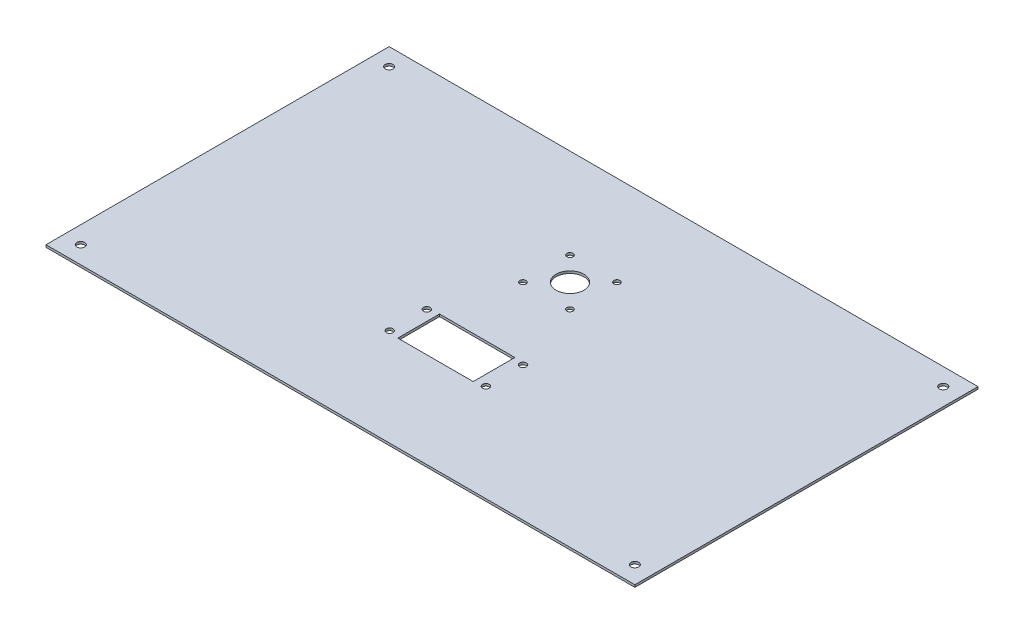
ISO-10303-21;
HEADER;
FILE_DESCRIPTION(('STEP AP214'),'2;1');
FILE_NAME('part.step','',(''),(''),'','','');
FILE_SCHEMA(('AUTOMOTIVE_DESIGN { 1 0 10303 214 1 1 1 1 }'));
ENDSEC;
DATA;
#1=APPLICATION_CONTEXT('core data for automotive mechanical design processes');
#2=APPLICATION_PROTOCOL_DEFINITION('international standard','automotive_design',2000,#1);
#3=PRODUCT_CONTEXT('',#1,'mechanical');
#4=PRODUCT('Part','Part','',(#3));
#5=PRODUCT_RELATED_PRODUCT_CATEGORY('part','',(#4));
#6=PRODUCT_DEFINITION_FORMATION('','',#4);
#7=PRODUCT_DEFINITION_CONTEXT('part definition',#1,'design');
#8=PRODUCT_DEFINITION('design','',#6,#7);
#9=PRODUCT_DEFINITION_SHAPE('','',#8);
#10=(LENGTH_UNIT() NAMED_UNIT(*) SI_UNIT(.MILLI.,.METRE.));
#11=(NAMED_UNIT(*) PLANE_ANGLE_UNIT() SI_UNIT($,.RADIAN.));
#12=(NAMED_UNIT(*) SI_UNIT($,.STERADIAN.) SOLID_ANGLE_UNIT());
#13=UNCERTAINTY_MEASURE_WITH_UNIT(LENGTH_MEASURE(1.E-05),#10,'distance_accuracy_value','');
#14=(GEOMETRIC_REPRESENTATION_CONTEXT(3) GLOBAL_UNCERTAINTY_ASSIGNED_CONTEXT((#13)) GLOBAL_UNIT_ASSIGNED_CONTEXT((#10,
#11,#12)) REPRESENTATION_CONTEXT('',''));
#15=CARTESIAN_POINT('',(0.,0.,0.));
#16=DIRECTION('',(0.,0.,1.));
#17=DIRECTION('',(1.,0.,0.));
#18=AXIS2_PLACEMENT_3D('',#15,#16,#17);
#19=CARTESIAN_POINT('',(254.,2.,148.));
#20=DIRECTION('',(-1.,0.,0.));
#21=DIRECTION('',(0.,0.,1.));
#22=AXIS2_PLACEMENT_3D('',#19,#20,#21);
#23=PLANE('',#22);
#24=DIRECTION('',(0.,0.,-1.));
#25=VECTOR('',#24,1.);
#26=CARTESIAN_POINT('',(254.,0.,148.));
#27=LINE('',#26,#25);
#28=CARTESIAN_POINT('',(254.,0.,148.));
#29=VERTEX_POINT('',#28);
#30=CARTESIAN_POINT('',(254.,0.,-148.));
#31=VERTEX_POINT('',#30);
#32=EDGE_CURVE('E154',#29,#31,#27,.T.);
#33=ORIENTED_EDGE('',*,*,#32,.T.);
#34=DIRECTION('',(0.,-1.,0.));
#35=VECTOR('',#34,1.);
#36=CARTESIAN_POINT('',(254.,2.,-148.));
#37=LINE('',#36,#35);
#38=CARTESIAN_POINT('',(254.,2.,-148.));
#39=VERTEX_POINT('',#38);
#40=EDGE_CURVE('E170',#39,#31,#37,.T.);
#41=ORIENTED_EDGE('',*,*,#40,.F.);
#42=DIRECTION('',(0.,0.,-1.));
#43=VECTOR('',#42,1.);
#44=CARTESIAN_POINT('',(254.,2.,148.));
#45=LINE('',#44,#43);
#46=CARTESIAN_POINT('',(254.,2.,148.));
#47=VERTEX_POINT('',#46);
#48=EDGE_CURVE('E143',#47,#39,#45,.T.);
#49=ORIENTED_EDGE('',*,*,#48,.F.);
#50=DIRECTION('',(0.,-1.,0.));
#51=VECTOR('',#50,1.);
#52=CARTESIAN_POINT('',(254.,2.,148.));
#53=LINE('',#52,#51);
#54=EDGE_CURVE('E153',#47,#29,#53,.T.);
#55=ORIENTED_EDGE('',*,*,#54,.T.);
#56=EDGE_LOOP('',(#33,#41,#49,#55));
#57=FACE_BOUND('',#56,.T.);
#58=ADVANCED_FACE('F40',(#57),#23,.F.);
#59=CARTESIAN_POINT('',(-254.,2.,-148.));
#60=DIRECTION('',(0.,0.,1.));
#61=DIRECTION('',(1.,0.,0.));
#62=AXIS2_PLACEMENT_3D('',#59,#60,#61);
#63=PLANE('',#62);
#64=DIRECTION('',(-1.,0.,0.));
#65=VECTOR('',#64,1.);
#66=CARTESIAN_POINT('',(-254.,0.,-148.));
#67=LINE('',#66,#65);
#68=CARTESIAN_POINT('',(-254.,0.,-148.));
#69=VERTEX_POINT('',#68);
#70=EDGE_CURVE('E157',#31,#69,#67,.T.);
#71=ORIENTED_EDGE('',*,*,#70,.T.);
#72=DIRECTION('',(0.,-1.,0.));
#73=VECTOR('',#72,1.);
#74=CARTESIAN_POINT('',(-254.,2.,-148.));
#75=LINE('',#74,#73);
#76=CARTESIAN_POINT('',(-254.,2.,-148.));
#77=VERTEX_POINT('',#76);
#78=EDGE_CURVE('E167',#77,#69,#75,.T.);
#79=ORIENTED_EDGE('',*,*,#78,.F.);
#80=DIRECTION('',(-1.,0.,0.));
#81=VECTOR('',#80,1.);
#82=CARTESIAN_POINT('',(-254.,2.,-148.));
#83=LINE('',#82,#81);
#84=EDGE_CURVE('E146',#39,#77,#83,.T.);
#85=ORIENTED_EDGE('',*,*,#84,.F.);
#86=ORIENTED_EDGE('',*,*,#40,.T.);
#87=EDGE_LOOP('',(#71,#79,#85,#86));
#88=FACE_BOUND('',#87,.T.);
#89=ADVANCED_FACE('F246',(#88),#63,.F.);
#90=CARTESIAN_POINT('',(-254.,2.,148.));
#91=DIRECTION('',(1.,0.,0.));
#92=DIRECTION('',(0.,0.,-1.));
#93=AXIS2_PLACEMENT_3D('',#90,#91,#92);
#94=PLANE('',#93);
#95=DIRECTION('',(0.,0.,1.));
#96=VECTOR('',#95,1.);
#97=CARTESIAN_POINT('',(-254.,0.,148.));
#98=LINE('',#97,#96);
#99=CARTESIAN_POINT('',(-254.,0.,148.));
#100=VERTEX_POINT('',#99);
#101=EDGE_CURVE('E159',#69,#100,#98,.T.);
#102=ORIENTED_EDGE('',*,*,#101,.T.);
#103=DIRECTION('',(0.,-1.,0.));
#104=VECTOR('',#103,1.);
#105=CARTESIAN_POINT('',(-254.,2.,148.));
#106=LINE('',#105,#104);
#107=CARTESIAN_POINT('',(-254.,2.,148.));
#108=VERTEX_POINT('',#107);
#109=EDGE_CURVE('E164',#108,#100,#106,.T.);
#110=ORIENTED_EDGE('',*,*,#109,.F.);
#111=DIRECTION('',(0.,0.,1.));
#112=VECTOR('',#111,1.);
#113=CARTESIAN_POINT('',(-254.,2.,148.));
#114=LINE('',#113,#112);
#115=EDGE_CURVE('E149',#77,#108,#114,.T.);
#116=ORIENTED_EDGE('',*,*,#115,.F.);
#117=ORIENTED_EDGE('',*,*,#78,.T.);
#118=EDGE_LOOP('',(#102,#110,#116,#117));
#119=FACE_BOUND('',#118,.T.);
#120=ADVANCED_FACE('F243',(#119),#94,.F.);
#121=CARTESIAN_POINT('',(-254.,2.,148.));
#122=DIRECTION('',(0.,0.,-1.));
#123=DIRECTION('',(-1.,0.,0.));
#124=AXIS2_PLACEMENT_3D('',#121,#122,#123);
#125=PLANE('',#124);
#126=DIRECTION('',(1.,0.,0.));
#127=VECTOR('',#126,1.);
#128=CARTESIAN_POINT('',(-254.,0.,148.));
#129=LINE('',#128,#127);
#130=EDGE_CURVE('E147',#100,#29,#129,.T.);
#131=ORIENTED_EDGE('',*,*,#130,.T.);
#132=ORIENTED_EDGE('',*,*,#54,.F.);
#133=DIRECTION('',(1.,0.,0.));
#134=VECTOR('',#133,1.);
#135=CARTESIAN_POINT('',(-254.,2.,148.));
#136=LINE('',#135,#134);
#137=EDGE_CURVE('E151',#108,#47,#136,.T.);
#138=ORIENTED_EDGE('',*,*,#137,.F.);
#139=ORIENTED_EDGE('',*,*,#109,.T.);
#140=EDGE_LOOP('',(#131,#132,#138,#139));
#141=FACE_BOUND('',#140,.T.);
#142=ADVANCED_FACE('F239',(#141),#125,.F.);
#143=CARTESIAN_POINT('',(0.,2.,0.));
#144=DIRECTION('',(0.,-1.,0.));
#145=DIRECTION('',(0.,0.,-1.));
#146=AXIS2_PLACEMENT_3D('',#143,#144,#145);
#147=PLANE('',#146);
#148=CARTESIAN_POINT('',(239.,2.,133.));
#149=DIRECTION('',(0.,-1.,0.));
#150=DIRECTION('',(0.,0.,-1.));
#151=AXIS2_PLACEMENT_3D('',#148,#149,#150);
#152=CIRCLE('',#151,3.39999999999999);
#153=CARTESIAN_POINT('',(239.,2.,129.6));
#154=VERTEX_POINT('',#153);
#155=EDGE_CURVE('E507',#154,#154,#152,.T.);
#156=ORIENTED_EDGE('',*,*,#155,.T.);
#157=EDGE_LOOP('',(#156));
#158=FACE_BOUND('',#157,.T.);
#159=CARTESIAN_POINT('',(-239.,2.,-133.));
#160=DIRECTION('',(0.,-1.,0.));
#161=DIRECTION('',(0.,0.,-1.));
#162=AXIS2_PLACEMENT_3D('',#159,#160,#161);
#163=CIRCLE('',#162,3.39999999999999);
#164=CARTESIAN_POINT('',(-239.,2.,-136.4));
#165=VERTEX_POINT('',#164);
#166=EDGE_CURVE('E509',#165,#165,#163,.T.);
#167=ORIENTED_EDGE('',*,*,#166,.T.);
#168=EDGE_LOOP('',(#167));
#169=FACE_BOUND('',#168,.T.);
#170=CARTESIAN_POINT('',(239.,2.,-133.));
#171=DIRECTION('',(0.,-1.,0.));
#172=DIRECTION('',(0.,0.,-1.));
#173=AXIS2_PLACEMENT_3D('',#170,#171,#172);
#174=CIRCLE('',#173,3.39999999999999);
#175=CARTESIAN_POINT('',(239.,2.,-136.4));
#176=VERTEX_POINT('',#175);
#177=EDGE_CURVE('E515',#176,#176,#174,.T.);
#178=ORIENTED_EDGE('',*,*,#177,.T.);
#179=EDGE_LOOP('',(#178));
#180=FACE_BOUND('',#179,.T.);
#181=CARTESIAN_POINT('',(-239.,2.,133.));
#182=DIRECTION('',(0.,-1.,0.));
#183=DIRECTION('',(0.,0.,-1.));
#184=AXIS2_PLACEMENT_3D('',#181,#182,#183);
#185=CIRCLE('',#184,3.39999999999999);
#186=CARTESIAN_POINT('',(-239.,2.,129.6));
#187=VERTEX_POINT('',#186);
#188=EDGE_CURVE('E555',#187,#187,#185,.T.);
#189=ORIENTED_EDGE('',*,*,#188,.T.);
#190=EDGE_LOOP('',(#189));
#191=FACE_BOUND('',#190,.T.);
#192=CARTESIAN_POINT('',(-20.28,2.,-70.28));
#193=DIRECTION('',(0.,1.,0.));
#194=DIRECTION('',(0.,0.,1.));
#195=AXIS2_PLACEMENT_3D('',#192,#193,#194);
#196=CIRCLE('',#195,2.65);
#197=CARTESIAN_POINT('',(-20.28,2.,-67.63));
#198=VERTEX_POINT('',#197);
#199=EDGE_CURVE('E142',#198,#198,#196,.T.);
#200=ORIENTED_EDGE('',*,*,#199,.F.);
#201=EDGE_LOOP('',(#200));
#202=FACE_BOUND('',#201,.T.);
#203=CARTESIAN_POINT('',(-20.28,2.,-29.72));
#204=DIRECTION('',(0.,1.,0.));
#205=DIRECTION('',(0.,0.,-1.));
#206=AXIS2_PLACEMENT_3D('',#203,#204,#205);
#207=CIRCLE('',#206,2.65);
#208=CARTESIAN_POINT('',(-20.28,2.,-32.37));
#209=VERTEX_POINT('',#208);
#210=EDGE_CURVE('E521',#209,#209,#207,.T.);
#211=ORIENTED_EDGE('',*,*,#210,.F.);
#212=EDGE_LOOP('',(#211));
#213=FACE_BOUND('',#212,.T.);
#214=CARTESIAN_POINT('',(20.28,2.,-29.72));
#215=DIRECTION('',(0.,1.,0.));
#216=DIRECTION('',(0.,0.,1.));
#217=AXIS2_PLACEMENT_3D('',#214,#215,#216);
#218=CIRCLE('',#217,2.65);
#219=CARTESIAN_POINT('',(20.28,2.,-27.07));
#220=VERTEX_POINT('',#219);
#221=EDGE_CURVE('E130',#220,#220,#218,.T.);
#222=ORIENTED_EDGE('',*,*,#221,.F.);
#223=EDGE_LOOP('',(#222));
#224=FACE_BOUND('',#223,.T.);
#225=CARTESIAN_POINT('',(20.28,2.,-70.28));
#226=DIRECTION('',(0.,1.,0.));
#227=DIRECTION('',(0.,0.,-1.));
#228=AXIS2_PLACEMENT_3D('',#225,#226,#227);
#229=CIRCLE('',#228,2.65);
#230=CARTESIAN_POINT('',(20.28,2.,-72.93));
#231=VERTEX_POINT('',#230);
#232=EDGE_CURVE('E127',#231,#231,#229,.T.);
#233=ORIENTED_EDGE('',*,*,#232,.F.);
#234=EDGE_LOOP('',(#233));
#235=FACE_BOUND('',#234,.T.);
#236=CARTESIAN_POINT('',(-41.5,2.,64.));
#237=DIRECTION('',(0.,1.,0.));
#238=DIRECTION('',(0.,0.,1.));
#239=AXIS2_PLACEMENT_3D('',#236,#237,#238);
#240=CIRCLE('',#239,2.9);
#241=CARTESIAN_POINT('',(-41.5,2.,66.9));
#242=VERTEX_POINT('',#241);
#243=EDGE_CURVE('E512',#242,#242,#240,.T.);
#244=ORIENTED_EDGE('',*,*,#243,.F.);
#245=EDGE_LOOP('',(#244));
#246=FACE_BOUND('',#245,.T.);
#247=CARTESIAN_POINT('',(41.5,2.,64.));
#248=DIRECTION('',(0.,1.,0.));
#249=DIRECTION('',(0.,0.,1.));
#250=AXIS2_PLACEMENT_3D('',#247,#248,#249);
#251=CIRCLE('',#250,2.9);
#252=CARTESIAN_POINT('',(41.5,2.,66.9));
#253=VERTEX_POINT('',#252);
#254=EDGE_CURVE('E137',#253,#253,#251,.T.);
#255=ORIENTED_EDGE('',*,*,#254,.F.);
#256=EDGE_LOOP('',(#255));
#257=FACE_BOUND('',#256,.T.);
#258=CARTESIAN_POINT('',(41.5,2.,32.));
#259=DIRECTION('',(0.,1.,0.));
#260=DIRECTION('',(0.,0.,1.));
#261=AXIS2_PLACEMENT_3D('',#258,#259,#260);
#262=CIRCLE('',#261,2.9);
#263=CARTESIAN_POINT('',(41.5,2.,34.9));
#264=VERTEX_POINT('',#263);
#265=EDGE_CURVE('E111',#264,#264,#262,.T.);
#266=ORIENTED_EDGE('',*,*,#265,.F.);
#267=EDGE_LOOP('',(#266));
#268=FACE_BOUND('',#267,.T.);
#269=DIRECTION('',(-1.,0.,0.));
#270=VECTOR('',#269,1.);
#271=CARTESIAN_POINT('',(32.5,2.,30.));
#272=LINE('',#271,#270);
#273=CARTESIAN_POINT('',(32.5,2.,30.));
#274=VERTEX_POINT('',#273);
#275=CARTESIAN_POINT('',(-32.5,2.,30.));
#276=VERTEX_POINT('',#275);
#277=EDGE_CURVE('E126',#274,#276,#272,.T.);
#278=ORIENTED_EDGE('',*,*,#277,.F.);
#279=DIRECTION('',(0.,0.,-1.));
#280=VECTOR('',#279,1.);
#281=CARTESIAN_POINT('',(32.5,2.,30.));
#282=LINE('',#281,#280);
#283=CARTESIAN_POINT('',(32.5,2.,66.));
#284=VERTEX_POINT('',#283);
#285=EDGE_CURVE('E56',#284,#274,#282,.T.);
#286=ORIENTED_EDGE('',*,*,#285,.F.);
#287=DIRECTION('',(1.,0.,0.));
#288=VECTOR('',#287,1.);
#289=CARTESIAN_POINT('',(32.5,2.,66.));
#290=LINE('',#289,#288);
#291=CARTESIAN_POINT('',(-32.5,2.,66.));
#292=VERTEX_POINT('',#291);
#293=EDGE_CURVE('E114',#292,#284,#290,.T.);
#294=ORIENTED_EDGE('',*,*,#293,.F.);
#295=DIRECTION('',(0.,0.,1.));
#296=VECTOR('',#295,1.);
#297=CARTESIAN_POINT('',(-32.5,2.,30.));
#298=LINE('',#297,#296);
#299=EDGE_CURVE('E120',#276,#292,#298,.T.);
#300=ORIENTED_EDGE('',*,*,#299,.F.);
#301=EDGE_LOOP('',(#278,#286,#294,#300));
#302=FACE_BOUND('',#301,.T.);
#303=CARTESIAN_POINT('',(-41.5,2.,32.));
#304=DIRECTION('',(0.,1.,0.));
#305=DIRECTION('',(0.,0.,1.));
#306=AXIS2_PLACEMENT_3D('',#303,#304,#305);
#307=CIRCLE('',#306,2.9);
#308=CARTESIAN_POINT('',(-41.5,2.,34.9));
#309=VERTEX_POINT('',#308);
#310=EDGE_CURVE('E508',#309,#309,#307,.T.);
#311=ORIENTED_EDGE('',*,*,#310,.F.);
#312=EDGE_LOOP('',(#311));
#313=FACE_BOUND('',#312,.T.);
#314=CARTESIAN_POINT('',(0.,2.,-50.));
#315=DIRECTION('',(0.,1.,0.));
#316=DIRECTION('',(0.,0.,1.));
#317=AXIS2_PLACEMENT_3D('',#314,#315,#316);
#318=CIRCLE('',#317,12.);
#319=CARTESIAN_POINT('',(0.,2.,-38.));
#320=VERTEX_POINT('',#319);
#321=EDGE_CURVE('E138',#320,#320,#318,.T.);
#322=ORIENTED_EDGE('',*,*,#321,.F.);
#323=EDGE_LOOP('',(#322));
#324=FACE_BOUND('',#323,.T.);
#325=ORIENTED_EDGE('',*,*,#48,.T.);
#326=ORIENTED_EDGE('',*,*,#84,.T.);
#327=ORIENTED_EDGE('',*,*,#115,.T.);
#328=ORIENTED_EDGE('',*,*,#137,.T.);
#329=EDGE_LOOP('',(#325,#326,#327,#328));
#330=FACE_BOUND('',#329,.T.);
#331=ADVANCED_FACE('F124',(#158,#169,#180,#191,#202,#213,#224,#235,#246,#257,#268,#302,#313,
#324,#330),#147,.F.);
#332=CARTESIAN_POINT('',(0.,0.,0.));
#333=DIRECTION('',(0.,-1.,0.));
#334=DIRECTION('',(0.,0.,-1.));
#335=AXIS2_PLACEMENT_3D('',#332,#333,#334);
#336=PLANE('',#335);
#337=CARTESIAN_POINT('',(239.,0.,133.));
#338=DIRECTION('',(0.,-1.,0.));
#339=DIRECTION('',(0.,0.,1.));
#340=AXIS2_PLACEMENT_3D('',#337,#338,#339);
#341=CIRCLE('',#340,3.39999999999999);
#342=CARTESIAN_POINT('',(239.,0.,136.4));
#343=VERTEX_POINT('',#342);
#344=EDGE_CURVE('E505',#343,#343,#341,.T.);
#345=ORIENTED_EDGE('',*,*,#344,.F.);
#346=EDGE_LOOP('',(#345));
#347=FACE_BOUND('',#346,.T.);
#348=CARTESIAN_POINT('',(-239.,0.,-133.));
#349=DIRECTION('',(0.,-1.,0.));
#350=DIRECTION('',(0.,0.,1.));
#351=AXIS2_PLACEMENT_3D('',#348,#349,#350);
#352=CIRCLE('',#351,3.39999999999999);
#353=CARTESIAN_POINT('',(-239.,0.,-129.6));
#354=VERTEX_POINT('',#353);
#355=EDGE_CURVE('E561',#354,#354,#352,.T.);
#356=ORIENTED_EDGE('',*,*,#355,.F.);
#357=EDGE_LOOP('',(#356));
#358=FACE_BOUND('',#357,.T.);
#359=CARTESIAN_POINT('',(239.,0.,-133.));
#360=DIRECTION('',(0.,-1.,0.));
#361=DIRECTION('',(0.,0.,-1.));
#362=AXIS2_PLACEMENT_3D('',#359,#360,#361);
#363=CIRCLE('',#362,3.39999999999999);
#364=CARTESIAN_POINT('',(239.,0.,-136.4));
#365=VERTEX_POINT('',#364);
#366=EDGE_CURVE('E564',#365,#365,#363,.T.);
#367=ORIENTED_EDGE('',*,*,#366,.F.);
#368=EDGE_LOOP('',(#367));
#369=FACE_BOUND('',#368,.T.);
#370=CARTESIAN_POINT('',(-239.,0.,133.));
#371=DIRECTION('',(0.,-1.,0.));
#372=DIRECTION('',(0.,0.,-1.));
#373=AXIS2_PLACEMENT_3D('',#370,#371,#372);
#374=CIRCLE('',#373,3.39999999999999);
#375=CARTESIAN_POINT('',(-239.,0.,129.6));
#376=VERTEX_POINT('',#375);
#377=EDGE_CURVE('E558',#376,#376,#374,.T.);
#378=ORIENTED_EDGE('',*,*,#377,.F.);
#379=EDGE_LOOP('',(#378));
#380=FACE_BOUND('',#379,.T.);
#381=CARTESIAN_POINT('',(-20.28,0.,-70.28));
#382=DIRECTION('',(0.,-1.,0.));
#383=DIRECTION('',(0.,0.,-1.));
#384=AXIS2_PLACEMENT_3D('',#381,#382,#383);
#385=CIRCLE('',#384,2.65);
#386=CARTESIAN_POINT('',(-20.28,0.,-72.93));
#387=VERTEX_POINT('',#386);
#388=EDGE_CURVE('E43',#387,#387,#385,.T.);
#389=ORIENTED_EDGE('',*,*,#388,.F.);
#390=EDGE_LOOP('',(#389));
#391=FACE_BOUND('',#390,.T.);
#392=CARTESIAN_POINT('',(-20.28,0.,-29.72));
#393=DIRECTION('',(0.,-1.,0.));
#394=DIRECTION('',(0.,0.,-1.));
#395=AXIS2_PLACEMENT_3D('',#392,#393,#394);
#396=CIRCLE('',#395,2.65);
#397=CARTESIAN_POINT('',(-20.28,0.,-32.37));
#398=VERTEX_POINT('',#397);
#399=EDGE_CURVE('E197',#398,#398,#396,.T.);
#400=ORIENTED_EDGE('',*,*,#399,.F.);
#401=EDGE_LOOP('',(#400));
#402=FACE_BOUND('',#401,.T.);
#403=CARTESIAN_POINT('',(20.28,0.,-29.72));
#404=DIRECTION('',(0.,-1.,0.));
#405=DIRECTION('',(0.,0.,-1.));
#406=AXIS2_PLACEMENT_3D('',#403,#404,#405);
#407=CIRCLE('',#406,2.65);
#408=CARTESIAN_POINT('',(20.28,0.,-32.37));
#409=VERTEX_POINT('',#408);
#410=EDGE_CURVE('E195',#409,#409,#407,.T.);
#411=ORIENTED_EDGE('',*,*,#410,.F.);
#412=EDGE_LOOP('',(#411));
#413=FACE_BOUND('',#412,.T.);
#414=CARTESIAN_POINT('',(20.28,0.,-70.28));
#415=DIRECTION('',(0.,-1.,0.));
#416=DIRECTION('',(0.,0.,-1.));
#417=AXIS2_PLACEMENT_3D('',#414,#415,#416);
#418=CIRCLE('',#417,2.65);
#419=CARTESIAN_POINT('',(20.28,0.,-72.93));
#420=VERTEX_POINT('',#419);
#421=EDGE_CURVE('E192',#420,#420,#418,.T.);
#422=ORIENTED_EDGE('',*,*,#421,.F.);
#423=EDGE_LOOP('',(#422));
#424=FACE_BOUND('',#423,.T.);
#425=CARTESIAN_POINT('',(-41.5,0.,64.));
#426=DIRECTION('',(0.,-1.,0.));
#427=DIRECTION('',(0.,0.,-1.));
#428=AXIS2_PLACEMENT_3D('',#425,#426,#427);
#429=CIRCLE('',#428,2.9);
#430=CARTESIAN_POINT('',(-41.5,0.,61.1));
#431=VERTEX_POINT('',#430);
#432=EDGE_CURVE('E189',#431,#431,#429,.T.);
#433=ORIENTED_EDGE('',*,*,#432,.F.);
#434=EDGE_LOOP('',(#433));
#435=FACE_BOUND('',#434,.T.);
#436=CARTESIAN_POINT('',(41.5,0.,64.));
#437=DIRECTION('',(0.,-1.,0.));
#438=DIRECTION('',(0.,0.,-1.));
#439=AXIS2_PLACEMENT_3D('',#436,#437,#438);
#440=CIRCLE('',#439,2.9);
#441=CARTESIAN_POINT('',(41.5,0.,61.1));
#442=VERTEX_POINT('',#441);
#443=EDGE_CURVE('E186',#442,#442,#440,.T.);
#444=ORIENTED_EDGE('',*,*,#443,.F.);
#445=EDGE_LOOP('',(#444));
#446=FACE_BOUND('',#445,.T.);
#447=CARTESIAN_POINT('',(41.5,0.,32.));
#448=DIRECTION('',(0.,-1.,0.));
#449=DIRECTION('',(0.,0.,-1.));
#450=AXIS2_PLACEMENT_3D('',#447,#448,#449);
#451=CIRCLE('',#450,2.9);
#452=CARTESIAN_POINT('',(41.5,0.,29.1));
#453=VERTEX_POINT('',#452);
#454=EDGE_CURVE('E179',#453,#453,#451,.T.);
#455=ORIENTED_EDGE('',*,*,#454,.F.);
#456=EDGE_LOOP('',(#455));
#457=FACE_BOUND('',#456,.T.);
#458=DIRECTION('',(0.,0.,1.));
#459=VECTOR('',#458,1.);
#460=CARTESIAN_POINT('',(32.5,0.,0.));
#461=LINE('',#460,#459);
#462=CARTESIAN_POINT('',(32.5,0.,30.));
#463=VERTEX_POINT('',#462);
#464=CARTESIAN_POINT('',(32.5,0.,66.));
#465=VERTEX_POINT('',#464);
#466=EDGE_CURVE('E11',#463,#465,#461,.T.);
#467=ORIENTED_EDGE('',*,*,#466,.F.);
#468=DIRECTION('',(1.,0.,0.));
#469=VECTOR('',#468,1.);
#470=CARTESIAN_POINT('',(0.,0.,30.));
#471=LINE('',#470,#469);
#472=CARTESIAN_POINT('',(-32.5,0.,30.));
#473=VERTEX_POINT('',#472);
#474=EDGE_CURVE('E173',#473,#463,#471,.T.);
#475=ORIENTED_EDGE('',*,*,#474,.F.);
#476=DIRECTION('',(0.,0.,-1.));
#477=VECTOR('',#476,1.);
#478=CARTESIAN_POINT('',(-32.5,0.,0.));
#479=LINE('',#478,#477);
#480=CARTESIAN_POINT('',(-32.5,0.,66.));
#481=VERTEX_POINT('',#480);
#482=EDGE_CURVE('E181',#481,#473,#479,.T.);
#483=ORIENTED_EDGE('',*,*,#482,.F.);
#484=DIRECTION('',(-1.,0.,0.));
#485=VECTOR('',#484,1.);
#486=CARTESIAN_POINT('',(0.,0.,66.));
#487=LINE('',#486,#485);
#488=EDGE_CURVE('E48',#465,#481,#487,.T.);
#489=ORIENTED_EDGE('',*,*,#488,.F.);
#490=EDGE_LOOP('',(#467,#475,#483,#489));
#491=FACE_BOUND('',#490,.T.);
#492=CARTESIAN_POINT('',(-41.5,0.,32.));
#493=DIRECTION('',(0.,-1.,0.));
#494=DIRECTION('',(0.,0.,-1.));
#495=AXIS2_PLACEMENT_3D('',#492,#493,#494);
#496=CIRCLE('',#495,2.9);
#497=CARTESIAN_POINT('',(-41.5,0.,29.1));
#498=VERTEX_POINT('',#497);
#499=EDGE_CURVE('E176',#498,#498,#496,.T.);
#500=ORIENTED_EDGE('',*,*,#499,.F.);
#501=EDGE_LOOP('',(#500));
#502=FACE_BOUND('',#501,.T.);
#503=CARTESIAN_POINT('',(0.,0.,-50.));
#504=DIRECTION('',(0.,-1.,0.));
#505=DIRECTION('',(0.,0.,-1.));
#506=AXIS2_PLACEMENT_3D('',#503,#504,#505);
#507=CIRCLE('',#506,12.);
#508=CARTESIAN_POINT('',(0.,0.,-62.));
#509=VERTEX_POINT('',#508);
#510=EDGE_CURVE('E141',#509,#509,#507,.T.);
#511=ORIENTED_EDGE('',*,*,#510,.F.);
#512=EDGE_LOOP('',(#511));
#513=FACE_BOUND('',#512,.T.);
#514=ORIENTED_EDGE('',*,*,#32,.F.);
#515=ORIENTED_EDGE('',*,*,#130,.F.);
#516=ORIENTED_EDGE('',*,*,#101,.F.);
#517=ORIENTED_EDGE('',*,*,#70,.F.);
#518=EDGE_LOOP('',(#514,#515,#516,#517));
#519=FACE_BOUND('',#518,.T.);
#520=ADVANCED_FACE('F207',(#347,#358,#369,#380,#391,#402,#413,#424,#435,#446,#457,#491,#502,
#513,#519),#336,.T.);
#521=CARTESIAN_POINT('',(0.,-8.,-50.));
#522=DIRECTION('',(0.,1.,0.));
#523=DIRECTION('',(0.,0.,1.));
#524=AXIS2_PLACEMENT_3D('',#521,#522,#523);
#525=CYLINDRICAL_SURFACE('',#524,12.);
#526=ORIENTED_EDGE('',*,*,#510,.T.);
#527=EDGE_LOOP('',(#526));
#528=FACE_BOUND('',#527,.T.);
#529=ORIENTED_EDGE('',*,*,#321,.T.);
#530=EDGE_LOOP('',(#529));
#531=FACE_BOUND('',#530,.T.);
#532=ADVANCED_FACE('F210',(#528,#531),#525,.F.);
#533=CARTESIAN_POINT('',(-41.5,-8.,32.));
#534=DIRECTION('',(0.,1.,0.));
#535=DIRECTION('',(0.,0.,1.));
#536=AXIS2_PLACEMENT_3D('',#533,#534,#535);
#537=CYLINDRICAL_SURFACE('',#536,2.9);
#538=ORIENTED_EDGE('',*,*,#499,.T.);
#539=EDGE_LOOP('',(#538));
#540=FACE_BOUND('',#539,.T.);
#541=ORIENTED_EDGE('',*,*,#310,.T.);
#542=EDGE_LOOP('',(#541));
#543=FACE_BOUND('',#542,.T.);
#544=ADVANCED_FACE('F283',(#540,#543),#537,.F.);
#545=CARTESIAN_POINT('',(32.5,-8.,30.));
#546=DIRECTION('',(1.,0.,0.));
#547=DIRECTION('',(0.,0.,-1.));
#548=AXIS2_PLACEMENT_3D('',#545,#546,#547);
#549=PLANE('',#548);
#550=ORIENTED_EDGE('',*,*,#466,.T.);
#551=DIRECTION('',(0.,1.,0.));
#552=VECTOR('',#551,1.);
#553=CARTESIAN_POINT('',(32.5,-8.,66.));
#554=LINE('',#553,#552);
#555=EDGE_CURVE('E104',#465,#284,#554,.T.);
#556=ORIENTED_EDGE('',*,*,#555,.T.);
#557=ORIENTED_EDGE('',*,*,#285,.T.);
#558=DIRECTION('',(0.,1.,0.));
#559=VECTOR('',#558,1.);
#560=CARTESIAN_POINT('',(32.5,-8.,30.));
#561=LINE('',#560,#559);
#562=EDGE_CURVE('E121',#463,#274,#561,.T.);
#563=ORIENTED_EDGE('',*,*,#562,.F.);
#564=EDGE_LOOP('',(#550,#556,#557,#563));
#565=FACE_BOUND('',#564,.T.);
#566=ADVANCED_FACE('F106',(#565),#549,.F.);
#567=CARTESIAN_POINT('',(32.5,-8.,66.));
#568=DIRECTION('',(0.,0.,1.));
#569=DIRECTION('',(1.,0.,0.));
#570=AXIS2_PLACEMENT_3D('',#567,#568,#569);
#571=PLANE('',#570);
#572=ORIENTED_EDGE('',*,*,#488,.T.);
#573=DIRECTION('',(0.,1.,0.));
#574=VECTOR('',#573,1.);
#575=CARTESIAN_POINT('',(-32.5,-8.,66.));
#576=LINE('',#575,#574);
#577=EDGE_CURVE('E110',#481,#292,#576,.T.);
#578=ORIENTED_EDGE('',*,*,#577,.T.);
#579=ORIENTED_EDGE('',*,*,#293,.T.);
#580=ORIENTED_EDGE('',*,*,#555,.F.);
#581=EDGE_LOOP('',(#572,#578,#579,#580));
#582=FACE_BOUND('',#581,.T.);
#583=ADVANCED_FACE('F115',(#582),#571,.F.);
#584=CARTESIAN_POINT('',(-32.5,-8.,30.));
#585=DIRECTION('',(-1.,0.,0.));
#586=DIRECTION('',(0.,0.,1.));
#587=AXIS2_PLACEMENT_3D('',#584,#585,#586);
#588=PLANE('',#587);
#589=ORIENTED_EDGE('',*,*,#482,.T.);
#590=DIRECTION('',(0.,1.,0.));
#591=VECTOR('',#590,1.);
#592=CARTESIAN_POINT('',(-32.5,-8.,30.));
#593=LINE('',#592,#591);
#594=EDGE_CURVE('E64',#473,#276,#593,.T.);
#595=ORIENTED_EDGE('',*,*,#594,.T.);
#596=ORIENTED_EDGE('',*,*,#299,.T.);
#597=ORIENTED_EDGE('',*,*,#577,.F.);
#598=EDGE_LOOP('',(#589,#595,#596,#597));
#599=FACE_BOUND('',#598,.T.);
#600=ADVANCED_FACE('F313',(#599),#588,.F.);
#601=CARTESIAN_POINT('',(32.5,-8.,30.));
#602=DIRECTION('',(0.,0.,-1.));
#603=DIRECTION('',(-1.,0.,0.));
#604=AXIS2_PLACEMENT_3D('',#601,#602,#603);
#605=PLANE('',#604);
#606=ORIENTED_EDGE('',*,*,#474,.T.);
#607=ORIENTED_EDGE('',*,*,#562,.T.);
#608=ORIENTED_EDGE('',*,*,#277,.T.);
#609=ORIENTED_EDGE('',*,*,#594,.F.);
#610=EDGE_LOOP('',(#606,#607,#608,#609));
#611=FACE_BOUND('',#610,.T.);
#612=ADVANCED_FACE('F323',(#611),#605,.F.);
#613=CARTESIAN_POINT('',(41.5,-8.,32.));
#614=DIRECTION('',(0.,1.,0.));
#615=DIRECTION('',(0.,0.,1.));
#616=AXIS2_PLACEMENT_3D('',#613,#614,#615);
#617=CYLINDRICAL_SURFACE('',#616,2.9);
#618=ORIENTED_EDGE('',*,*,#454,.T.);
#619=EDGE_LOOP('',(#618));
#620=FACE_BOUND('',#619,.T.);
#621=ORIENTED_EDGE('',*,*,#265,.T.);
#622=EDGE_LOOP('',(#621));
#623=FACE_BOUND('',#622,.T.);
#624=ADVANCED_FACE('F334',(#620,#623),#617,.F.);
#625=CARTESIAN_POINT('',(41.5,-8.,64.));
#626=DIRECTION('',(0.,1.,0.));
#627=DIRECTION('',(0.,0.,1.));
#628=AXIS2_PLACEMENT_3D('',#625,#626,#627);
#629=CYLINDRICAL_SURFACE('',#628,2.9);
#630=ORIENTED_EDGE('',*,*,#443,.T.);
#631=EDGE_LOOP('',(#630));
#632=FACE_BOUND('',#631,.T.);
#633=ORIENTED_EDGE('',*,*,#254,.T.);
#634=EDGE_LOOP('',(#633));
#635=FACE_BOUND('',#634,.T.);
#636=ADVANCED_FACE('F344',(#632,#635),#629,.F.);
#637=CARTESIAN_POINT('',(-41.5,-8.,64.));
#638=DIRECTION('',(0.,1.,0.));
#639=DIRECTION('',(0.,0.,1.));
#640=AXIS2_PLACEMENT_3D('',#637,#638,#639);
#641=CYLINDRICAL_SURFACE('',#640,2.9);
#642=ORIENTED_EDGE('',*,*,#432,.T.);
#643=EDGE_LOOP('',(#642));
#644=FACE_BOUND('',#643,.T.);
#645=ORIENTED_EDGE('',*,*,#243,.T.);
#646=EDGE_LOOP('',(#645));
#647=FACE_BOUND('',#646,.T.);
#648=ADVANCED_FACE('F355',(#644,#647),#641,.F.);
#649=CARTESIAN_POINT('',(20.28,-8.,-70.28));
#650=DIRECTION('',(0.,1.,0.));
#651=DIRECTION('',(0.,0.,1.));
#652=AXIS2_PLACEMENT_3D('',#649,#650,#651);
#653=CYLINDRICAL_SURFACE('',#652,2.65);
#654=ORIENTED_EDGE('',*,*,#421,.T.);
#655=EDGE_LOOP('',(#654));
#656=FACE_BOUND('',#655,.T.);
#657=ORIENTED_EDGE('',*,*,#232,.T.);
#658=EDGE_LOOP('',(#657));
#659=FACE_BOUND('',#658,.T.);
#660=ADVANCED_FACE('F366',(#656,#659),#653,.F.);
#661=CARTESIAN_POINT('',(20.28,-8.,-29.72));
#662=DIRECTION('',(0.,1.,0.));
#663=DIRECTION('',(0.,0.,1.));
#664=AXIS2_PLACEMENT_3D('',#661,#662,#663);
#665=CYLINDRICAL_SURFACE('',#664,2.65);
#666=ORIENTED_EDGE('',*,*,#410,.T.);
#667=EDGE_LOOP('',(#666));
#668=FACE_BOUND('',#667,.T.);
#669=ORIENTED_EDGE('',*,*,#221,.T.);
#670=EDGE_LOOP('',(#669));
#671=FACE_BOUND('',#670,.T.);
#672=ADVANCED_FACE('F377',(#668,#671),#665,.F.);
#673=CARTESIAN_POINT('',(-20.28,-8.,-29.72));
#674=DIRECTION('',(0.,1.,0.));
#675=DIRECTION('',(0.,0.,1.));
#676=AXIS2_PLACEMENT_3D('',#673,#674,#675);
#677=CYLINDRICAL_SURFACE('',#676,2.65);
#678=ORIENTED_EDGE('',*,*,#399,.T.);
#679=EDGE_LOOP('',(#678));
#680=FACE_BOUND('',#679,.T.);
#681=ORIENTED_EDGE('',*,*,#210,.T.);
#682=EDGE_LOOP('',(#681));
#683=FACE_BOUND('',#682,.T.);
#684=ADVANCED_FACE('F388',(#680,#683),#677,.F.);
#685=CARTESIAN_POINT('',(-20.28,-8.,-70.28));
#686=DIRECTION('',(0.,1.,0.));
#687=DIRECTION('',(0.,0.,1.));
#688=AXIS2_PLACEMENT_3D('',#685,#686,#687);
#689=CYLINDRICAL_SURFACE('',#688,2.65);
#690=ORIENTED_EDGE('',*,*,#388,.T.);
#691=EDGE_LOOP('',(#690));
#692=FACE_BOUND('',#691,.T.);
#693=ORIENTED_EDGE('',*,*,#199,.T.);
#694=EDGE_LOOP('',(#693));
#695=FACE_BOUND('',#694,.T.);
#696=ADVANCED_FACE('F204',(#692,#695),#689,.F.);
#697=CARTESIAN_POINT('',(-239.,10.,133.));
#698=DIRECTION('',(0.,-1.,0.));
#699=DIRECTION('',(0.,0.,-1.));
#700=AXIS2_PLACEMENT_3D('',#697,#698,#699);
#701=CYLINDRICAL_SURFACE('',#700,3.39999999999999);
#702=ORIENTED_EDGE('',*,*,#377,.T.);
#703=EDGE_LOOP('',(#702));
#704=FACE_BOUND('',#703,.T.);
#705=ORIENTED_EDGE('',*,*,#188,.F.);
#706=EDGE_LOOP('',(#705));
#707=FACE_BOUND('',#706,.T.);
#708=ADVANCED_FACE('F407',(#704,#707),#701,.F.);
#709=CARTESIAN_POINT('',(239.,10.,-133.));
#710=DIRECTION('',(0.,-1.,0.));
#711=DIRECTION('',(0.,0.,-1.));
#712=AXIS2_PLACEMENT_3D('',#709,#710,#711);
#713=CYLINDRICAL_SURFACE('',#712,3.39999999999999);
#714=ORIENTED_EDGE('',*,*,#366,.T.);
#715=EDGE_LOOP('',(#714));
#716=FACE_BOUND('',#715,.T.);
#717=ORIENTED_EDGE('',*,*,#177,.F.);
#718=EDGE_LOOP('',(#717));
#719=FACE_BOUND('',#718,.T.);
#720=ADVANCED_FACE('F428',(#716,#719),#713,.F.);
#721=CARTESIAN_POINT('',(-239.,10.,-133.));
#722=DIRECTION('',(0.,-1.,0.));
#723=DIRECTION('',(0.,0.,-1.));
#724=AXIS2_PLACEMENT_3D('',#721,#722,#723);
#725=CYLINDRICAL_SURFACE('',#724,3.39999999999999);
#726=ORIENTED_EDGE('',*,*,#355,.T.);
#727=EDGE_LOOP('',(#726));
#728=FACE_BOUND('',#727,.T.);
#729=ORIENTED_EDGE('',*,*,#166,.F.);
#730=EDGE_LOOP('',(#729));
#731=FACE_BOUND('',#730,.T.);
#732=ADVANCED_FACE('F439',(#728,#731),#725,.F.);
#733=CARTESIAN_POINT('',(239.,10.,133.));
#734=DIRECTION('',(0.,-1.,0.));
#735=DIRECTION('',(0.,0.,-1.));
#736=AXIS2_PLACEMENT_3D('',#733,#734,#735);
#737=CYLINDRICAL_SURFACE('',#736,3.39999999999999);
#738=ORIENTED_EDGE('',*,*,#344,.T.);
#739=EDGE_LOOP('',(#738));
#740=FACE_BOUND('',#739,.T.);
#741=ORIENTED_EDGE('',*,*,#155,.F.);
#742=EDGE_LOOP('',(#741));
#743=FACE_BOUND('',#742,.T.);
#744=ADVANCED_FACE('F450',(#740,#743),#737,.F.);
#745=CLOSED_SHELL('',(#58,#89,#120,#142,#331,#520,#532,#544,#566,#583,#600,#612,#624,#636,#648,
#660,#672,#684,#696,#708,#720,#732,#744));
#746=MANIFOLD_SOLID_BREP('B2',#745);
#747=ADVANCED_BREP_SHAPE_REPRESENTATION('',(#18,#746),#14);
#748=SHAPE_DEFINITION_REPRESENTATION(#9,#747);
ENDSEC;
END-ISO-10303-21;
